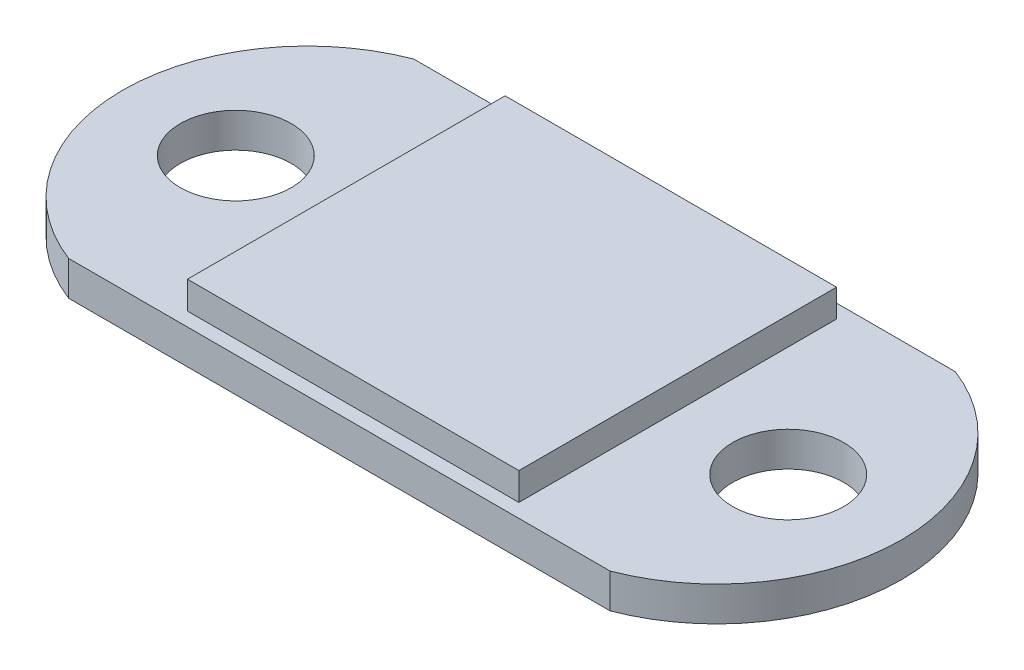
ISO-10303-21;
HEADER;
FILE_DESCRIPTION(('STEP AP214'),'2;1');
FILE_NAME('part.step','',(''),(''),'','','');
FILE_SCHEMA(('AUTOMOTIVE_DESIGN { 1 0 10303 214 1 1 1 1 }'));
ENDSEC;
DATA;
#1=APPLICATION_CONTEXT('core data for automotive mechanical design processes');
#2=APPLICATION_PROTOCOL_DEFINITION('international standard','automotive_design',2000,#1);
#3=PRODUCT_CONTEXT('',#1,'mechanical');
#4=PRODUCT('Part','Part','',(#3));
#5=PRODUCT_RELATED_PRODUCT_CATEGORY('part','',(#4));
#6=PRODUCT_DEFINITION_FORMATION('','',#4);
#7=PRODUCT_DEFINITION_CONTEXT('part definition',#1,'design');
#8=PRODUCT_DEFINITION('design','',#6,#7);
#9=PRODUCT_DEFINITION_SHAPE('','',#8);
#10=(LENGTH_UNIT() NAMED_UNIT(*) SI_UNIT(.MILLI.,.METRE.));
#11=(NAMED_UNIT(*) PLANE_ANGLE_UNIT() SI_UNIT($,.RADIAN.));
#12=(NAMED_UNIT(*) SI_UNIT($,.STERADIAN.) SOLID_ANGLE_UNIT());
#13=UNCERTAINTY_MEASURE_WITH_UNIT(LENGTH_MEASURE(1.E-05),#10,'distance_accuracy_value','');
#14=(GEOMETRIC_REPRESENTATION_CONTEXT(3) GLOBAL_UNCERTAINTY_ASSIGNED_CONTEXT((#13)) GLOBAL_UNIT_ASSIGNED_CONTEXT((#10,
#11,#12)) REPRESENTATION_CONTEXT('',''));
#15=CARTESIAN_POINT('',(0.,0.,0.));
#16=DIRECTION('',(0.,0.,1.));
#17=DIRECTION('',(1.,0.,0.));
#18=AXIS2_PLACEMENT_3D('',#15,#16,#17);
#19=CARTESIAN_POINT('',(0.,-2.54,0.));
#20=DIRECTION('',(0.,-1.,0.));
#21=DIRECTION('',(0.,0.,-1.));
#22=AXIS2_PLACEMENT_3D('',#19,#20,#21);
#23=PLANE('',#22);
#24=DIRECTION('',(0.,0.,1.));
#25=VECTOR('',#24,1.);
#26=CARTESIAN_POINT('',(16.8275,-2.54,5.08));
#27=LINE('',#26,#25);
#28=CARTESIAN_POINT('',(16.8275,-2.54,-5.08));
#29=VERTEX_POINT('',#28);
#30=CARTESIAN_POINT('',(16.8275,-2.54,5.08));
#31=VERTEX_POINT('',#30);
#32=EDGE_CURVE('E144',#29,#31,#27,.T.);
#33=ORIENTED_EDGE('',*,*,#32,.T.);
#34=DIRECTION('',(-1.,0.,0.));
#35=VECTOR('',#34,1.);
#36=CARTESIAN_POINT('',(8.5725,-2.54,5.08));
#37=LINE('',#36,#35);
#38=CARTESIAN_POINT('',(8.5725,-2.54,5.08));
#39=VERTEX_POINT('',#38);
#40=EDGE_CURVE('E130',#31,#39,#37,.T.);
#41=ORIENTED_EDGE('',*,*,#40,.T.);
#42=DIRECTION('',(0.,0.,-1.));
#43=VECTOR('',#42,1.);
#44=CARTESIAN_POINT('',(8.5725,-2.54,5.08));
#45=LINE('',#44,#43);
#46=CARTESIAN_POINT('',(8.5725,-2.54,-5.08));
#47=VERTEX_POINT('',#46);
#48=EDGE_CURVE('E27',#39,#47,#45,.T.);
#49=ORIENTED_EDGE('',*,*,#48,.T.);
#50=DIRECTION('',(1.,0.,0.));
#51=VECTOR('',#50,1.);
#52=CARTESIAN_POINT('',(8.5725,-2.54,-5.08));
#53=LINE('',#52,#51);
#54=EDGE_CURVE('E11',#47,#29,#53,.T.);
#55=ORIENTED_EDGE('',*,*,#54,.T.);
#56=EDGE_LOOP('',(#33,#41,#49,#55));
#57=FACE_BOUND('',#56,.T.);
#58=ADVANCED_FACE('F16',(#57),#23,.T.);
#59=CARTESIAN_POINT('',(8.5725,-2.54,-5.08));
#60=DIRECTION('',(0.,0.,1.));
#61=DIRECTION('',(1.,0.,0.));
#62=AXIS2_PLACEMENT_3D('',#59,#60,#61);
#63=PLANE('',#62);
#64=DIRECTION('',(1.,0.,0.));
#65=VECTOR('',#64,1.);
#66=CARTESIAN_POINT('',(8.5725,0.,-5.08));
#67=LINE('',#66,#65);
#68=CARTESIAN_POINT('',(8.5725,0.,-5.08));
#69=VERTEX_POINT('',#68);
#70=CARTESIAN_POINT('',(16.8275,0.,-5.08));
#71=VERTEX_POINT('',#70);
#72=EDGE_CURVE('E20',#69,#71,#67,.T.);
#73=ORIENTED_EDGE('',*,*,#72,.T.);
#74=DIRECTION('',(0.,1.,0.));
#75=VECTOR('',#74,1.);
#76=CARTESIAN_POINT('',(16.8275,-2.54,-5.08));
#77=LINE('',#76,#75);
#78=EDGE_CURVE('E148',#29,#71,#77,.T.);
#79=ORIENTED_EDGE('',*,*,#78,.F.);
#80=ORIENTED_EDGE('',*,*,#54,.F.);
#81=DIRECTION('',(0.,1.,0.));
#82=VECTOR('',#81,1.);
#83=CARTESIAN_POINT('',(8.5725,-2.54,-5.08));
#84=LINE('',#83,#82);
#85=EDGE_CURVE('E141',#47,#69,#84,.T.);
#86=ORIENTED_EDGE('',*,*,#85,.T.);
#87=EDGE_LOOP('',(#73,#79,#80,#86));
#88=FACE_BOUND('',#87,.T.);
#89=ADVANCED_FACE('F321',(#88),#63,.F.);
#90=CARTESIAN_POINT('',(8.5725,-2.54,5.08));
#91=DIRECTION('',(1.,0.,0.));
#92=DIRECTION('',(0.,0.,1.));
#93=AXIS2_PLACEMENT_3D('',#90,#91,#92);
#94=PLANE('',#93);
#95=DIRECTION('',(0.,0.,-1.));
#96=VECTOR('',#95,1.);
#97=CARTESIAN_POINT('',(8.5725,0.,5.08));
#98=LINE('',#97,#96);
#99=CARTESIAN_POINT('',(8.5725,0.,5.08));
#100=VERTEX_POINT('',#99);
#101=EDGE_CURVE('E203',#100,#69,#98,.T.);
#102=ORIENTED_EDGE('',*,*,#101,.T.);
#103=ORIENTED_EDGE('',*,*,#85,.F.);
#104=ORIENTED_EDGE('',*,*,#48,.F.);
#105=DIRECTION('',(0.,1.,0.));
#106=VECTOR('',#105,1.);
#107=CARTESIAN_POINT('',(8.5725,-2.54,5.08));
#108=LINE('',#107,#106);
#109=EDGE_CURVE('E138',#39,#100,#108,.T.);
#110=ORIENTED_EDGE('',*,*,#109,.T.);
#111=EDGE_LOOP('',(#102,#103,#104,#110));
#112=FACE_BOUND('',#111,.T.);
#113=ADVANCED_FACE('F261',(#112),#94,.F.);
#114=CARTESIAN_POINT('',(8.5725,-2.54,5.08));
#115=DIRECTION('',(0.,0.,-1.));
#116=DIRECTION('',(0.,-1.,0.));
#117=AXIS2_PLACEMENT_3D('',#114,#115,#116);
#118=PLANE('',#117);
#119=DIRECTION('',(-1.,0.,0.));
#120=VECTOR('',#119,1.);
#121=CARTESIAN_POINT('',(8.5725,0.,5.08));
#122=LINE('',#121,#120);
#123=CARTESIAN_POINT('',(16.8275,0.,5.08));
#124=VERTEX_POINT('',#123);
#125=EDGE_CURVE('E199',#124,#100,#122,.T.);
#126=ORIENTED_EDGE('',*,*,#125,.T.);
#127=ORIENTED_EDGE('',*,*,#109,.F.);
#128=ORIENTED_EDGE('',*,*,#40,.F.);
#129=DIRECTION('',(0.,1.,0.));
#130=VECTOR('',#129,1.);
#131=CARTESIAN_POINT('',(16.8275,-2.54,5.08));
#132=LINE('',#131,#130);
#133=EDGE_CURVE('E135',#31,#124,#132,.T.);
#134=ORIENTED_EDGE('',*,*,#133,.T.);
#135=EDGE_LOOP('',(#126,#127,#128,#134));
#136=FACE_BOUND('',#135,.T.);
#137=ADVANCED_FACE('F133',(#136),#118,.F.);
#138=CARTESIAN_POINT('',(16.8275,-2.54,5.08));
#139=DIRECTION('',(-1.,0.,0.));
#140=DIRECTION('',(0.,0.,1.));
#141=AXIS2_PLACEMENT_3D('',#138,#139,#140);
#142=PLANE('',#141);
#143=DIRECTION('',(0.,0.,1.));
#144=VECTOR('',#143,1.);
#145=CARTESIAN_POINT('',(16.8275,0.,5.08));
#146=LINE('',#145,#144);
#147=EDGE_CURVE('E152',#71,#124,#146,.T.);
#148=ORIENTED_EDGE('',*,*,#147,.T.);
#149=ORIENTED_EDGE('',*,*,#133,.F.);
#150=ORIENTED_EDGE('',*,*,#32,.F.);
#151=ORIENTED_EDGE('',*,*,#78,.T.);
#152=EDGE_LOOP('',(#148,#149,#150,#151));
#153=FACE_BOUND('',#152,.T.);
#154=ADVANCED_FACE('F150',(#153),#142,.F.);
#155=CARTESIAN_POINT('',(0.,2.8575,0.));
#156=DIRECTION('',(0.,1.,0.));
#157=DIRECTION('',(1.,0.,0.));
#158=AXIS2_PLACEMENT_3D('',#155,#156,#157);
#159=PLANE('',#158);
#160=DIRECTION('',(0.,0.,-1.));
#161=VECTOR('',#160,1.);
#162=CARTESIAN_POINT('',(20.32,2.8575,-7.3025));
#163=LINE('',#162,#161);
#164=CARTESIAN_POINT('',(20.32,2.8575,7.3025));
#165=VERTEX_POINT('',#164);
#166=CARTESIAN_POINT('',(20.32,2.8575,-7.3025));
#167=VERTEX_POINT('',#166);
#168=EDGE_CURVE('E188',#165,#167,#163,.T.);
#169=ORIENTED_EDGE('',*,*,#168,.T.);
#170=DIRECTION('',(-1.,0.,0.));
#171=VECTOR('',#170,1.);
#172=CARTESIAN_POINT('',(5.08,2.8575,-7.3025));
#173=LINE('',#172,#171);
#174=CARTESIAN_POINT('',(5.08,2.8575,-7.3025));
#175=VERTEX_POINT('',#174);
#176=EDGE_CURVE('E189',#167,#175,#173,.T.);
#177=ORIENTED_EDGE('',*,*,#176,.T.);
#178=DIRECTION('',(0.,0.,1.));
#179=VECTOR('',#178,1.);
#180=CARTESIAN_POINT('',(5.08,2.8575,-7.3025));
#181=LINE('',#180,#179);
#182=CARTESIAN_POINT('',(5.08,2.8575,7.3025));
#183=VERTEX_POINT('',#182);
#184=EDGE_CURVE('E160',#175,#183,#181,.T.);
#185=ORIENTED_EDGE('',*,*,#184,.T.);
#186=DIRECTION('',(1.,0.,0.));
#187=VECTOR('',#186,1.);
#188=CARTESIAN_POINT('',(5.08,2.8575,7.3025));
#189=LINE('',#188,#187);
#190=EDGE_CURVE('E154',#183,#165,#189,.T.);
#191=ORIENTED_EDGE('',*,*,#190,.T.);
#192=EDGE_LOOP('',(#169,#177,#185,#191));
#193=FACE_BOUND('',#192,.T.);
#194=ADVANCED_FACE('F339',(#193),#159,.T.);
#195=CARTESIAN_POINT('',(5.08,2.8575,7.3025));
#196=DIRECTION('',(0.,0.,-1.));
#197=DIRECTION('',(0.,-1.,0.));
#198=AXIS2_PLACEMENT_3D('',#195,#196,#197);
#199=PLANE('',#198);
#200=DIRECTION('',(1.,0.,0.));
#201=VECTOR('',#200,1.);
#202=CARTESIAN_POINT('',(5.08,1.5875,7.3025));
#203=LINE('',#202,#201);
#204=CARTESIAN_POINT('',(5.08,1.5875,7.3025));
#205=VERTEX_POINT('',#204);
#206=CARTESIAN_POINT('',(20.32,1.5875,7.3025));
#207=VERTEX_POINT('',#206);
#208=EDGE_CURVE('E182',#205,#207,#203,.T.);
#209=ORIENTED_EDGE('',*,*,#208,.T.);
#210=DIRECTION('',(0.,-1.,0.));
#211=VECTOR('',#210,1.);
#212=CARTESIAN_POINT('',(20.32,2.8575,7.3025));
#213=LINE('',#212,#211);
#214=EDGE_CURVE('E183',#165,#207,#213,.T.);
#215=ORIENTED_EDGE('',*,*,#214,.F.);
#216=ORIENTED_EDGE('',*,*,#190,.F.);
#217=DIRECTION('',(0.,-1.,0.));
#218=VECTOR('',#217,1.);
#219=CARTESIAN_POINT('',(5.08,2.8575,7.3025));
#220=LINE('',#219,#218);
#221=EDGE_CURVE('E193',#183,#205,#220,.T.);
#222=ORIENTED_EDGE('',*,*,#221,.T.);
#223=EDGE_LOOP('',(#209,#215,#216,#222));
#224=FACE_BOUND('',#223,.T.);
#225=ADVANCED_FACE('F331',(#224),#199,.F.);
#226=CARTESIAN_POINT('',(5.08,2.8575,-7.3025));
#227=DIRECTION('',(1.,0.,0.));
#228=DIRECTION('',(0.,0.,-1.));
#229=AXIS2_PLACEMENT_3D('',#226,#227,#228);
#230=PLANE('',#229);
#231=DIRECTION('',(0.,0.,1.));
#232=VECTOR('',#231,1.);
#233=CARTESIAN_POINT('',(5.08,1.5875,-7.3025));
#234=LINE('',#233,#232);
#235=CARTESIAN_POINT('',(5.08,1.5875,-7.3025));
#236=VERTEX_POINT('',#235);
#237=EDGE_CURVE('E177',#236,#205,#234,.T.);
#238=ORIENTED_EDGE('',*,*,#237,.T.);
#239=ORIENTED_EDGE('',*,*,#221,.F.);
#240=ORIENTED_EDGE('',*,*,#184,.F.);
#241=DIRECTION('',(0.,-1.,0.));
#242=VECTOR('',#241,1.);
#243=CARTESIAN_POINT('',(5.08,2.8575,-7.3025));
#244=LINE('',#243,#242);
#245=EDGE_CURVE('E187',#175,#236,#244,.T.);
#246=ORIENTED_EDGE('',*,*,#245,.T.);
#247=EDGE_LOOP('',(#238,#239,#240,#246));
#248=FACE_BOUND('',#247,.T.);
#249=ADVANCED_FACE('F327',(#248),#230,.F.);
#250=CARTESIAN_POINT('',(5.08,2.8575,-7.3025));
#251=DIRECTION('',(0.,0.,1.));
#252=DIRECTION('',(1.,0.,0.));
#253=AXIS2_PLACEMENT_3D('',#250,#251,#252);
#254=PLANE('',#253);
#255=DIRECTION('',(-1.,0.,0.));
#256=VECTOR('',#255,1.);
#257=CARTESIAN_POINT('',(5.08,1.5875,-7.3025));
#258=LINE('',#257,#256);
#259=CARTESIAN_POINT('',(20.32,1.5875,-7.3025));
#260=VERTEX_POINT('',#259);
#261=EDGE_CURVE('E171',#260,#236,#258,.T.);
#262=ORIENTED_EDGE('',*,*,#261,.T.);
#263=ORIENTED_EDGE('',*,*,#245,.F.);
#264=ORIENTED_EDGE('',*,*,#176,.F.);
#265=DIRECTION('',(0.,-1.,0.));
#266=VECTOR('',#265,1.);
#267=CARTESIAN_POINT('',(20.32,2.8575,-7.3025));
#268=LINE('',#267,#266);
#269=EDGE_CURVE('E168',#167,#260,#268,.T.);
#270=ORIENTED_EDGE('',*,*,#269,.T.);
#271=EDGE_LOOP('',(#262,#263,#264,#270));
#272=FACE_BOUND('',#271,.T.);
#273=ADVANCED_FACE('F330',(#272),#254,.F.);
#274=CARTESIAN_POINT('',(20.32,2.8575,-7.3025));
#275=DIRECTION('',(-1.,0.,0.));
#276=DIRECTION('',(0.,0.,1.));
#277=AXIS2_PLACEMENT_3D('',#274,#275,#276);
#278=PLANE('',#277);
#279=DIRECTION('',(0.,0.,-1.));
#280=VECTOR('',#279,1.);
#281=CARTESIAN_POINT('',(20.32,1.5875,-7.3025));
#282=LINE('',#281,#280);
#283=EDGE_CURVE('E175',#207,#260,#282,.T.);
#284=ORIENTED_EDGE('',*,*,#283,.T.);
#285=ORIENTED_EDGE('',*,*,#269,.F.);
#286=ORIENTED_EDGE('',*,*,#168,.F.);
#287=ORIENTED_EDGE('',*,*,#214,.T.);
#288=EDGE_LOOP('',(#284,#285,#286,#287));
#289=FACE_BOUND('',#288,.T.);
#290=ADVANCED_FACE('F345',(#289),#278,.F.);
#291=CARTESIAN_POINT('',(25.4,1.5875,0.));
#292=DIRECTION('',(0.,-1.,0.));
#293=DIRECTION('',(0.,0.,-1.));
#294=AXIS2_PLACEMENT_3D('',#291,#292,#293);
#295=CYLINDRICAL_SURFACE('',#294,2.5527);
#296=CARTESIAN_POINT('',(25.4,1.5875,0.));
#297=DIRECTION('',(0.,1.,0.));
#298=DIRECTION('',(0.,0.,1.));
#299=AXIS2_PLACEMENT_3D('',#296,#297,#298);
#300=CIRCLE('',#299,2.5527);
#301=CARTESIAN_POINT('',(25.4,1.5875,2.5527));
#302=VERTEX_POINT('',#301);
#303=EDGE_CURVE('E176',#302,#302,#300,.T.);
#304=ORIENTED_EDGE('',*,*,#303,.T.);
#305=EDGE_LOOP('',(#304));
#306=FACE_BOUND('',#305,.T.);
#307=CARTESIAN_POINT('',(25.4,0.,0.));
#308=DIRECTION('',(0.,1.,0.));
#309=DIRECTION('',(0.,0.,1.));
#310=AXIS2_PLACEMENT_3D('',#307,#308,#309);
#311=CIRCLE('',#310,2.5527);
#312=CARTESIAN_POINT('',(25.4,0.,2.5527));
#313=VERTEX_POINT('',#312);
#314=EDGE_CURVE('E194',#313,#313,#311,.T.);
#315=ORIENTED_EDGE('',*,*,#314,.F.);
#316=EDGE_LOOP('',(#315));
#317=FACE_BOUND('',#316,.T.);
#318=ADVANCED_FACE('F350',(#306,#317),#295,.F.);
#319=CARTESIAN_POINT('',(0.,1.5875,0.));
#320=DIRECTION('',(0.,-1.,0.));
#321=DIRECTION('',(0.,0.,-1.));
#322=AXIS2_PLACEMENT_3D('',#319,#320,#321);
#323=CYLINDRICAL_SURFACE('',#322,2.5527);
#324=CARTESIAN_POINT('',(0.,1.5875,0.));
#325=DIRECTION('',(0.,1.,0.));
#326=DIRECTION('',(0.,0.,1.));
#327=AXIS2_PLACEMENT_3D('',#324,#325,#326);
#328=CIRCLE('',#327,2.5527);
#329=CARTESIAN_POINT('',(0.,1.5875,2.5527));
#330=VERTEX_POINT('',#329);
#331=EDGE_CURVE('E229',#330,#330,#328,.T.);
#332=ORIENTED_EDGE('',*,*,#331,.T.);
#333=EDGE_LOOP('',(#332));
#334=FACE_BOUND('',#333,.T.);
#335=CARTESIAN_POINT('',(0.,0.,0.));
#336=DIRECTION('',(0.,1.,0.));
#337=DIRECTION('',(0.,0.,1.));
#338=AXIS2_PLACEMENT_3D('',#335,#336,#337);
#339=CIRCLE('',#338,2.5527);
#340=CARTESIAN_POINT('',(0.,0.,2.5527));
#341=VERTEX_POINT('',#340);
#342=EDGE_CURVE('E164',#341,#341,#339,.T.);
#343=ORIENTED_EDGE('',*,*,#342,.F.);
#344=EDGE_LOOP('',(#343));
#345=FACE_BOUND('',#344,.T.);
#346=ADVANCED_FACE('F353',(#334,#345),#323,.F.);
#347=CARTESIAN_POINT('',(0.252260986207465,1.5875,7.9375));
#348=DIRECTION('',(0.,0.,-1.));
#349=DIRECTION('',(0.,-1.,0.));
#350=AXIS2_PLACEMENT_3D('',#347,#348,#349);
#351=PLANE('',#350);
#352=DIRECTION('',(1.,0.,0.));
#353=VECTOR('',#352,1.);
#354=CARTESIAN_POINT('',(0.252260986207465,0.,7.9375));
#355=LINE('',#354,#353);
#356=CARTESIAN_POINT('',(0.252260986207465,0.,7.9375));
#357=VERTEX_POINT('',#356);
#358=CARTESIAN_POINT('',(25.1477390137925,0.,7.9375));
#359=VERTEX_POINT('',#358);
#360=EDGE_CURVE('E204',#357,#359,#355,.T.);
#361=ORIENTED_EDGE('',*,*,#360,.T.);
#362=DIRECTION('',(0.,-1.,0.));
#363=VECTOR('',#362,1.);
#364=CARTESIAN_POINT('',(25.1477390137925,1.5875,7.9375));
#365=LINE('',#364,#363);
#366=CARTESIAN_POINT('',(25.1477390137925,1.5875,7.9375));
#367=VERTEX_POINT('',#366);
#368=EDGE_CURVE('E218',#367,#359,#365,.T.);
#369=ORIENTED_EDGE('',*,*,#368,.F.);
#370=DIRECTION('',(1.,0.,0.));
#371=VECTOR('',#370,1.);
#372=CARTESIAN_POINT('',(0.252260986207465,1.5875,7.9375));
#373=LINE('',#372,#371);
#374=CARTESIAN_POINT('',(0.252260986207465,1.5875,7.9375));
#375=VERTEX_POINT('',#374);
#376=EDGE_CURVE('E224',#375,#367,#373,.T.);
#377=ORIENTED_EDGE('',*,*,#376,.F.);
#378=DIRECTION('',(0.,-1.,0.));
#379=VECTOR('',#378,1.);
#380=CARTESIAN_POINT('',(0.252260986207465,1.5875,7.9375));
#381=LINE('',#380,#379);
#382=EDGE_CURVE('E85',#375,#357,#381,.T.);
#383=ORIENTED_EDGE('',*,*,#382,.T.);
#384=EDGE_LOOP('',(#361,#369,#377,#383));
#385=FACE_BOUND('',#384,.T.);
#386=ADVANCED_FACE('F18',(#385),#351,.F.);
#387=CARTESIAN_POINT('',(3.293,1.5875,0.));
#388=DIRECTION('',(0.,-1.,0.));
#389=DIRECTION('',(0.,0.,-1.));
#390=AXIS2_PLACEMENT_3D('',#387,#388,#389);
#391=CYLINDRICAL_SURFACE('',#390,8.5);
#392=CARTESIAN_POINT('',(3.293,0.,0.));
#393=DIRECTION('',(0.,1.,0.));
#394=DIRECTION('',(0.,0.,1.));
#395=AXIS2_PLACEMENT_3D('',#392,#393,#394);
#396=CIRCLE('',#395,8.5);
#397=CARTESIAN_POINT('',(0.252260986207466,0.,-7.9375));
#398=VERTEX_POINT('',#397);
#399=EDGE_CURVE('E208',#398,#357,#396,.T.);
#400=ORIENTED_EDGE('',*,*,#399,.T.);
#401=ORIENTED_EDGE('',*,*,#382,.F.);
#402=CARTESIAN_POINT('',(3.293,1.5875,0.));
#403=DIRECTION('',(0.,1.,0.));
#404=DIRECTION('',(0.,0.,1.));
#405=AXIS2_PLACEMENT_3D('',#402,#403,#404);
#406=CIRCLE('',#405,8.5);
#407=CARTESIAN_POINT('',(0.252260986207466,1.5875,-7.9375));
#408=VERTEX_POINT('',#407);
#409=EDGE_CURVE('E220',#408,#375,#406,.T.);
#410=ORIENTED_EDGE('',*,*,#409,.F.);
#411=DIRECTION('',(0.,-1.,0.));
#412=VECTOR('',#411,1.);
#413=CARTESIAN_POINT('',(0.252260986207466,1.5875,-7.9375));
#414=LINE('',#413,#412);
#415=EDGE_CURVE('E102',#408,#398,#414,.T.);
#416=ORIENTED_EDGE('',*,*,#415,.T.);
#417=EDGE_LOOP('',(#400,#401,#410,#416));
#418=FACE_BOUND('',#417,.T.);
#419=ADVANCED_FACE('F310',(#418),#391,.T.);
#420=CARTESIAN_POINT('',(0.252260986207465,1.5875,-7.9375));
#421=DIRECTION('',(0.,0.,1.));
#422=DIRECTION('',(1.,0.,0.));
#423=AXIS2_PLACEMENT_3D('',#420,#421,#422);
#424=PLANE('',#423);
#425=DIRECTION('',(-1.,0.,0.));
#426=VECTOR('',#425,1.);
#427=CARTESIAN_POINT('',(0.252260986207465,0.,-7.9375));
#428=LINE('',#427,#426);
#429=CARTESIAN_POINT('',(25.1477390137925,0.,-7.9375));
#430=VERTEX_POINT('',#429);
#431=EDGE_CURVE('E198',#430,#398,#428,.T.);
#432=ORIENTED_EDGE('',*,*,#431,.T.);
#433=ORIENTED_EDGE('',*,*,#415,.F.);
#434=DIRECTION('',(-1.,0.,0.));
#435=VECTOR('',#434,1.);
#436=CARTESIAN_POINT('',(0.252260986207465,1.5875,-7.9375));
#437=LINE('',#436,#435);
#438=CARTESIAN_POINT('',(25.1477390137925,1.5875,-7.9375));
#439=VERTEX_POINT('',#438);
#440=EDGE_CURVE('E225',#439,#408,#437,.T.);
#441=ORIENTED_EDGE('',*,*,#440,.F.);
#442=DIRECTION('',(0.,-1.,0.));
#443=VECTOR('',#442,1.);
#444=CARTESIAN_POINT('',(25.1477390137925,1.5875,-7.9375));
#445=LINE('',#444,#443);
#446=EDGE_CURVE('E181',#439,#430,#445,.T.);
#447=ORIENTED_EDGE('',*,*,#446,.T.);
#448=EDGE_LOOP('',(#432,#433,#441,#447));
#449=FACE_BOUND('',#448,.T.);
#450=ADVANCED_FACE('F307',(#449),#424,.F.);
#451=CARTESIAN_POINT('',(22.107,1.5875,0.));
#452=DIRECTION('',(0.,-1.,0.));
#453=DIRECTION('',(0.,0.,-1.));
#454=AXIS2_PLACEMENT_3D('',#451,#452,#453);
#455=CYLINDRICAL_SURFACE('',#454,8.5);
#456=CARTESIAN_POINT('',(22.107,0.,0.));
#457=DIRECTION('',(0.,1.,0.));
#458=DIRECTION('',(0.,0.,1.));
#459=AXIS2_PLACEMENT_3D('',#456,#457,#458);
#460=CIRCLE('',#459,8.5);
#461=EDGE_CURVE('E209',#359,#430,#460,.T.);
#462=ORIENTED_EDGE('',*,*,#461,.T.);
#463=ORIENTED_EDGE('',*,*,#446,.F.);
#464=CARTESIAN_POINT('',(22.107,1.5875,0.));
#465=DIRECTION('',(0.,1.,0.));
#466=DIRECTION('',(0.,0.,1.));
#467=AXIS2_PLACEMENT_3D('',#464,#465,#466);
#468=CIRCLE('',#467,8.5);
#469=EDGE_CURVE('E202',#367,#439,#468,.T.);
#470=ORIENTED_EDGE('',*,*,#469,.F.);
#471=ORIENTED_EDGE('',*,*,#368,.T.);
#472=EDGE_LOOP('',(#462,#463,#470,#471));
#473=FACE_BOUND('',#472,.T.);
#474=ADVANCED_FACE('F304',(#473),#455,.T.);
#475=CARTESIAN_POINT('',(22.107,1.5875,0.));
#476=DIRECTION('',(0.,1.,0.));
#477=DIRECTION('',(1.,0.,0.));
#478=AXIS2_PLACEMENT_3D('',#475,#476,#477);
#479=PLANE('',#478);
#480=ORIENTED_EDGE('',*,*,#261,.F.);
#481=ORIENTED_EDGE('',*,*,#283,.F.);
#482=ORIENTED_EDGE('',*,*,#208,.F.);
#483=ORIENTED_EDGE('',*,*,#237,.F.);
#484=EDGE_LOOP('',(#480,#481,#482,#483));
#485=FACE_BOUND('',#484,.T.);
#486=ORIENTED_EDGE('',*,*,#303,.F.);
#487=EDGE_LOOP('',(#486));
#488=FACE_BOUND('',#487,.T.);
#489=ORIENTED_EDGE('',*,*,#331,.F.);
#490=EDGE_LOOP('',(#489));
#491=FACE_BOUND('',#490,.T.);
#492=ORIENTED_EDGE('',*,*,#469,.T.);
#493=ORIENTED_EDGE('',*,*,#440,.T.);
#494=ORIENTED_EDGE('',*,*,#409,.T.);
#495=ORIENTED_EDGE('',*,*,#376,.T.);
#496=EDGE_LOOP('',(#492,#493,#494,#495));
#497=FACE_BOUND('',#496,.T.);
#498=ADVANCED_FACE('F297',(#485,#488,#491,#497),#479,.T.);
#499=CARTESIAN_POINT('',(22.107,0.,0.));
#500=DIRECTION('',(0.,1.,0.));
#501=DIRECTION('',(1.,0.,0.));
#502=AXIS2_PLACEMENT_3D('',#499,#500,#501);
#503=PLANE('',#502);
#504=ORIENTED_EDGE('',*,*,#147,.F.);
#505=ORIENTED_EDGE('',*,*,#72,.F.);
#506=ORIENTED_EDGE('',*,*,#101,.F.);
#507=ORIENTED_EDGE('',*,*,#125,.F.);
#508=EDGE_LOOP('',(#504,#505,#506,#507));
#509=FACE_BOUND('',#508,.T.);
#510=ORIENTED_EDGE('',*,*,#342,.T.);
#511=EDGE_LOOP('',(#510));
#512=FACE_BOUND('',#511,.T.);
#513=ORIENTED_EDGE('',*,*,#314,.T.);
#514=EDGE_LOOP('',(#513));
#515=FACE_BOUND('',#514,.T.);
#516=ORIENTED_EDGE('',*,*,#461,.F.);
#517=ORIENTED_EDGE('',*,*,#360,.F.);
#518=ORIENTED_EDGE('',*,*,#399,.F.);
#519=ORIENTED_EDGE('',*,*,#431,.F.);
#520=EDGE_LOOP('',(#516,#517,#518,#519));
#521=FACE_BOUND('',#520,.T.);
#522=ADVANCED_FACE('F267',(#509,#512,#515,#521),#503,.F.);
#523=CLOSED_SHELL('',(#58,#89,#113,#137,#154,#194,#225,#249,#273,#290,#318,#346,#386,#419,#450,
#474,#498,#522));
#524=MANIFOLD_SOLID_BREP('B1',#523);
#525=ADVANCED_BREP_SHAPE_REPRESENTATION('',(#18,#524),#14);
#526=SHAPE_DEFINITION_REPRESENTATION(#9,#525);
ENDSEC;
END-ISO-10303-21;
